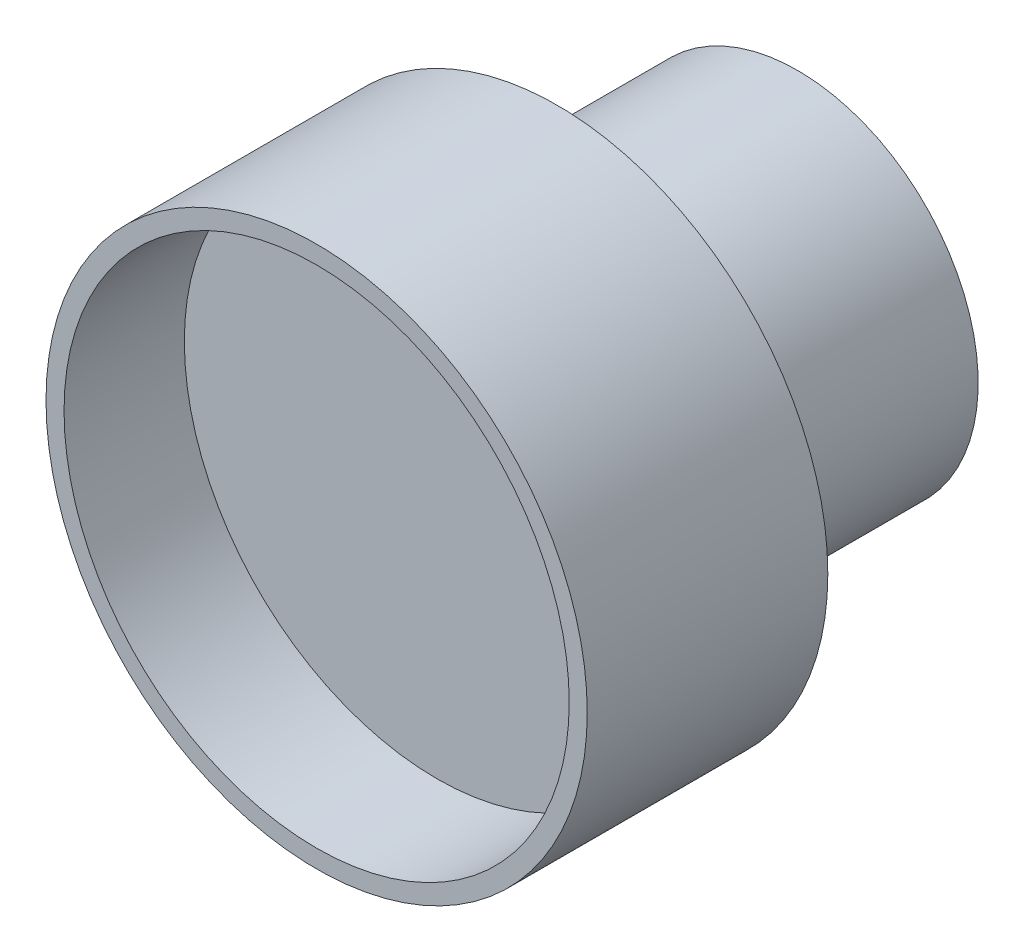
ISO-10303-21;
HEADER;
FILE_DESCRIPTION(('STEP AP214'),'2;1');
FILE_NAME('part.step','',(''),(''),'','','');
FILE_SCHEMA(('AUTOMOTIVE_DESIGN { 1 0 10303 214 1 1 1 1 }'));
ENDSEC;
DATA;
#1=APPLICATION_CONTEXT('core data for automotive mechanical design processes');
#2=APPLICATION_PROTOCOL_DEFINITION('international standard','automotive_design',2000,#1);
#3=PRODUCT_CONTEXT('',#1,'mechanical');
#4=PRODUCT('Part','Part','',(#3));
#5=PRODUCT_RELATED_PRODUCT_CATEGORY('part','',(#4));
#6=PRODUCT_DEFINITION_FORMATION('','',#4);
#7=PRODUCT_DEFINITION_CONTEXT('part definition',#1,'design');
#8=PRODUCT_DEFINITION('design','',#6,#7);
#9=PRODUCT_DEFINITION_SHAPE('','',#8);
#10=(LENGTH_UNIT() NAMED_UNIT(*) SI_UNIT(.MILLI.,.METRE.));
#11=(NAMED_UNIT(*) PLANE_ANGLE_UNIT() SI_UNIT($,.RADIAN.));
#12=(NAMED_UNIT(*) SI_UNIT($,.STERADIAN.) SOLID_ANGLE_UNIT());
#13=UNCERTAINTY_MEASURE_WITH_UNIT(LENGTH_MEASURE(1.E-05),#10,'distance_accuracy_value','');
#14=(GEOMETRIC_REPRESENTATION_CONTEXT(3) GLOBAL_UNCERTAINTY_ASSIGNED_CONTEXT((#13)) GLOBAL_UNIT_ASSIGNED_CONTEXT((#10,
#11,#12)) REPRESENTATION_CONTEXT('',''));
#15=CARTESIAN_POINT('',(0.,0.,0.));
#16=DIRECTION('',(0.,0.,1.));
#17=DIRECTION('',(1.,0.,0.));
#18=AXIS2_PLACEMENT_3D('',#15,#16,#17);
#19=CARTESIAN_POINT('',(0.,0.,20.));
#20=DIRECTION('',(0.,0.,-1.));
#21=DIRECTION('',(-1.,0.,0.));
#22=AXIS2_PLACEMENT_3D('',#19,#20,#21);
#23=CYLINDRICAL_SURFACE('',#22,22.5);
#24=CARTESIAN_POINT('',(0.,0.,20.));
#25=DIRECTION('',(0.,0.,1.));
#26=DIRECTION('',(1.,0.,0.));
#27=AXIS2_PLACEMENT_3D('',#24,#25,#26);
#28=CIRCLE('',#27,22.5);
#29=CARTESIAN_POINT('',(22.5,0.,20.));
#30=VERTEX_POINT('',#29);
#31=EDGE_CURVE('E38',#30,#30,#28,.T.);
#32=ORIENTED_EDGE('',*,*,#31,.F.);
#33=EDGE_LOOP('',(#32));
#34=FACE_BOUND('',#33,.T.);
#35=CARTESIAN_POINT('',(0.,0.,0.));
#36=DIRECTION('',(0.,0.,1.));
#37=DIRECTION('',(1.,0.,0.));
#38=AXIS2_PLACEMENT_3D('',#35,#36,#37);
#39=CIRCLE('',#38,22.5);
#40=CARTESIAN_POINT('',(22.5,0.,0.));
#41=VERTEX_POINT('',#40);
#42=EDGE_CURVE('E34',#41,#41,#39,.T.);
#43=ORIENTED_EDGE('',*,*,#42,.T.);
#44=EDGE_LOOP('',(#43));
#45=FACE_BOUND('',#44,.T.);
#46=ADVANCED_FACE('F31',(#34,#45),#23,.T.);
#47=CARTESIAN_POINT('',(0.,0.,20.));
#48=DIRECTION('',(0.,0.,1.));
#49=DIRECTION('',(1.,0.,0.));
#50=AXIS2_PLACEMENT_3D('',#47,#48,#49);
#51=PLANE('',#50);
#52=CARTESIAN_POINT('',(0.,0.,20.));
#53=DIRECTION('',(0.,0.,1.));
#54=DIRECTION('',(1.,0.,0.));
#55=AXIS2_PLACEMENT_3D('',#52,#53,#54);
#56=CIRCLE('',#55,21.);
#57=CARTESIAN_POINT('',(21.,0.,20.));
#58=VERTEX_POINT('',#57);
#59=EDGE_CURVE('E50',#58,#58,#56,.T.);
#60=ORIENTED_EDGE('',*,*,#59,.F.);
#61=EDGE_LOOP('',(#60));
#62=FACE_BOUND('',#61,.T.);
#63=ORIENTED_EDGE('',*,*,#31,.T.);
#64=EDGE_LOOP('',(#63));
#65=FACE_BOUND('',#64,.T.);
#66=ADVANCED_FACE('F83',(#62,#65),#51,.T.);
#67=CARTESIAN_POINT('',(0.,0.,0.));
#68=DIRECTION('',(0.,0.,1.));
#69=DIRECTION('',(1.,0.,0.));
#70=AXIS2_PLACEMENT_3D('',#67,#68,#69);
#71=PLANE('',#70);
#72=CARTESIAN_POINT('',(0.,0.,0.));
#73=DIRECTION('',(0.,0.,-1.));
#74=DIRECTION('',(-1.,0.,0.));
#75=AXIS2_PLACEMENT_3D('',#72,#73,#74);
#76=CIRCLE('',#75,15.);
#77=CARTESIAN_POINT('',(-15.,0.,0.));
#78=VERTEX_POINT('',#77);
#79=EDGE_CURVE('E10',#78,#78,#76,.T.);
#80=ORIENTED_EDGE('',*,*,#79,.F.);
#81=EDGE_LOOP('',(#80));
#82=FACE_BOUND('',#81,.T.);
#83=ORIENTED_EDGE('',*,*,#42,.F.);
#84=EDGE_LOOP('',(#83));
#85=FACE_BOUND('',#84,.T.);
#86=ADVANCED_FACE('F88',(#82,#85),#71,.F.);
#87=CARTESIAN_POINT('',(0.,0.,10.));
#88=DIRECTION('',(0.,0.,1.));
#89=DIRECTION('',(1.,0.,0.));
#90=AXIS2_PLACEMENT_3D('',#87,#88,#89);
#91=CYLINDRICAL_SURFACE('',#90,21.);
#92=CARTESIAN_POINT('',(0.,0.,10.));
#93=DIRECTION('',(0.,0.,1.));
#94=DIRECTION('',(1.,0.,0.));
#95=AXIS2_PLACEMENT_3D('',#92,#93,#94);
#96=CIRCLE('',#95,21.);
#97=CARTESIAN_POINT('',(21.,0.,10.));
#98=VERTEX_POINT('',#97);
#99=EDGE_CURVE('E47',#98,#98,#96,.T.);
#100=ORIENTED_EDGE('',*,*,#99,.F.);
#101=EDGE_LOOP('',(#100));
#102=FACE_BOUND('',#101,.T.);
#103=ORIENTED_EDGE('',*,*,#59,.T.);
#104=EDGE_LOOP('',(#103));
#105=FACE_BOUND('',#104,.T.);
#106=ADVANCED_FACE('F97',(#102,#105),#91,.F.);
#107=CARTESIAN_POINT('',(0.,0.,10.));
#108=DIRECTION('',(0.,0.,1.));
#109=DIRECTION('',(1.,0.,0.));
#110=AXIS2_PLACEMENT_3D('',#107,#108,#109);
#111=PLANE('',#110);
#112=ORIENTED_EDGE('',*,*,#99,.T.);
#113=EDGE_LOOP('',(#112));
#114=FACE_BOUND('',#113,.T.);
#115=ADVANCED_FACE('F79',(#114),#111,.T.);
#116=CARTESIAN_POINT('',(0.,0.,-20.));
#117=DIRECTION('',(0.,0.,1.));
#118=DIRECTION('',(1.,0.,0.));
#119=AXIS2_PLACEMENT_3D('',#116,#117,#118);
#120=CYLINDRICAL_SURFACE('',#119,15.);
#121=CARTESIAN_POINT('',(0.,0.,-20.));
#122=DIRECTION('',(0.,0.,-1.));
#123=DIRECTION('',(-1.,0.,0.));
#124=AXIS2_PLACEMENT_3D('',#121,#122,#123);
#125=CIRCLE('',#124,15.);
#126=CARTESIAN_POINT('',(-15.,0.,-20.));
#127=VERTEX_POINT('',#126);
#128=EDGE_CURVE('E45',#127,#127,#125,.T.);
#129=ORIENTED_EDGE('',*,*,#128,.F.);
#130=EDGE_LOOP('',(#129));
#131=FACE_BOUND('',#130,.T.);
#132=ORIENTED_EDGE('',*,*,#79,.T.);
#133=EDGE_LOOP('',(#132));
#134=FACE_BOUND('',#133,.T.);
#135=ADVANCED_FACE('F70',(#131,#134),#120,.T.);
#136=CARTESIAN_POINT('',(0.,0.,-20.));
#137=DIRECTION('',(0.,0.,-1.));
#138=DIRECTION('',(-1.,0.,0.));
#139=AXIS2_PLACEMENT_3D('',#136,#137,#138);
#140=PLANE('',#139);
#141=CARTESIAN_POINT('',(0.,0.,-20.));
#142=DIRECTION('',(0.,0.,-1.));
#143=DIRECTION('',(-1.,0.,0.));
#144=AXIS2_PLACEMENT_3D('',#141,#142,#143);
#145=CIRCLE('',#144,10.);
#146=CARTESIAN_POINT('',(-10.,0.,-20.));
#147=VERTEX_POINT('',#146);
#148=EDGE_CURVE('E59',#147,#147,#145,.T.);
#149=ORIENTED_EDGE('',*,*,#148,.F.);
#150=EDGE_LOOP('',(#149));
#151=FACE_BOUND('',#150,.T.);
#152=ORIENTED_EDGE('',*,*,#128,.T.);
#153=EDGE_LOOP('',(#152));
#154=FACE_BOUND('',#153,.T.);
#155=ADVANCED_FACE('F68',(#151,#154),#140,.T.);
#156=CARTESIAN_POINT('',(0.,0.,0.));
#157=DIRECTION('',(0.,0.,-1.));
#158=DIRECTION('',(-1.,0.,0.));
#159=AXIS2_PLACEMENT_3D('',#156,#157,#158);
#160=CYLINDRICAL_SURFACE('',#159,10.);
#161=CARTESIAN_POINT('',(0.,0.,0.));
#162=DIRECTION('',(0.,0.,-1.));
#163=DIRECTION('',(-1.,0.,0.));
#164=AXIS2_PLACEMENT_3D('',#161,#162,#163);
#165=CIRCLE('',#164,10.);
#166=CARTESIAN_POINT('',(-10.,0.,0.));
#167=VERTEX_POINT('',#166);
#168=EDGE_CURVE('E55',#167,#167,#165,.T.);
#169=ORIENTED_EDGE('',*,*,#168,.F.);
#170=EDGE_LOOP('',(#169));
#171=FACE_BOUND('',#170,.T.);
#172=ORIENTED_EDGE('',*,*,#148,.T.);
#173=EDGE_LOOP('',(#172));
#174=FACE_BOUND('',#173,.T.);
#175=ADVANCED_FACE('F66',(#171,#174),#160,.F.);
#176=CARTESIAN_POINT('',(0.,0.,0.));
#177=DIRECTION('',(0.,0.,-1.));
#178=DIRECTION('',(-1.,0.,0.));
#179=AXIS2_PLACEMENT_3D('',#176,#177,#178);
#180=PLANE('',#179);
#181=ORIENTED_EDGE('',*,*,#168,.T.);
#182=EDGE_LOOP('',(#181));
#183=FACE_BOUND('',#182,.T.);
#184=ADVANCED_FACE('F76',(#183),#180,.T.);
#185=CLOSED_SHELL('',(#46,#66,#86,#106,#115,#135,#155,#175,#184));
#186=MANIFOLD_SOLID_BREP('B2',#185);
#187=ADVANCED_BREP_SHAPE_REPRESENTATION('',(#18,#186),#14);
#188=SHAPE_DEFINITION_REPRESENTATION(#9,#187);
ENDSEC;
END-ISO-10303-21;
